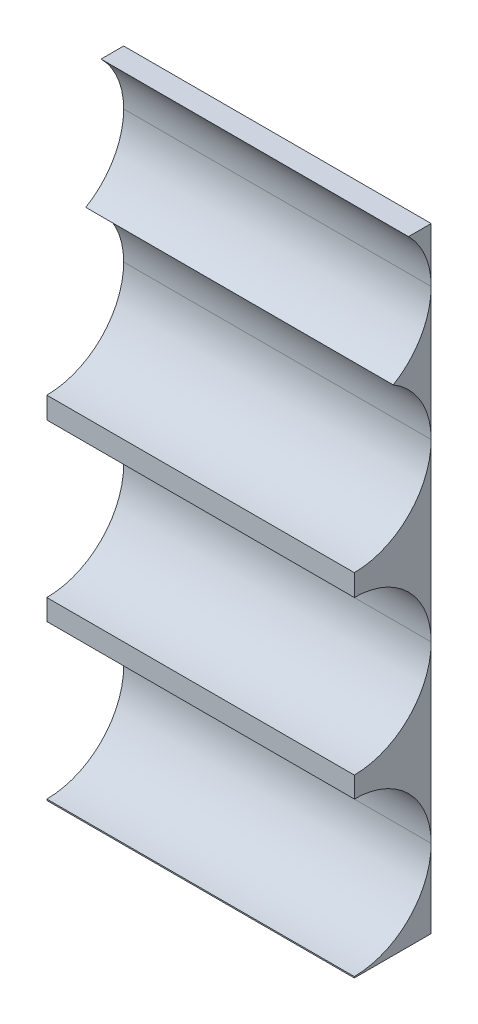
ISO-10303-21;
HEADER;
FILE_DESCRIPTION(('STEP AP214'),'2;1');
FILE_NAME('part.step','',(''),(''),'','','');
FILE_SCHEMA(('AUTOMOTIVE_DESIGN { 1 0 10303 214 1 1 1 1 }'));
ENDSEC;
DATA;
#1=APPLICATION_CONTEXT('core data for automotive mechanical design processes');
#2=APPLICATION_PROTOCOL_DEFINITION('international standard','automotive_design',2000,#1);
#3=PRODUCT_CONTEXT('',#1,'mechanical');
#4=PRODUCT('Part','Part','',(#3));
#5=PRODUCT_RELATED_PRODUCT_CATEGORY('part','',(#4));
#6=PRODUCT_DEFINITION_FORMATION('','',#4);
#7=PRODUCT_DEFINITION_CONTEXT('part definition',#1,'design');
#8=PRODUCT_DEFINITION('design','',#6,#7);
#9=PRODUCT_DEFINITION_SHAPE('','',#8);
#10=(LENGTH_UNIT() NAMED_UNIT(*) SI_UNIT(.MILLI.,.METRE.));
#11=(NAMED_UNIT(*) PLANE_ANGLE_UNIT() SI_UNIT($,.RADIAN.));
#12=(NAMED_UNIT(*) SI_UNIT($,.STERADIAN.) SOLID_ANGLE_UNIT());
#13=UNCERTAINTY_MEASURE_WITH_UNIT(LENGTH_MEASURE(1.E-05),#10,'distance_accuracy_value','');
#14=(GEOMETRIC_REPRESENTATION_CONTEXT(3) GLOBAL_UNCERTAINTY_ASSIGNED_CONTEXT((#13)) GLOBAL_UNIT_ASSIGNED_CONTEXT((#10,
#11,#12)) REPRESENTATION_CONTEXT('',''));
#15=CARTESIAN_POINT('',(0.,0.,0.));
#16=DIRECTION('',(0.,0.,1.));
#17=DIRECTION('',(1.,0.,0.));
#18=AXIS2_PLACEMENT_3D('',#15,#16,#17);
#19=CARTESIAN_POINT('',(0.,0.,2.));
#20=DIRECTION('',(0.,0.,-1.));
#21=DIRECTION('',(-1.,0.,0.));
#22=AXIS2_PLACEMENT_3D('',#19,#20,#21);
#23=PLANE('',#22);
#24=DIRECTION('',(0.,1.,0.));
#25=VECTOR('',#24,1.);
#26=CARTESIAN_POINT('',(8.,0.,2.));
#27=LINE('',#26,#25);
#28=CARTESIAN_POINT('',(8.,0.,2.));
#29=VERTEX_POINT('',#28);
#30=CARTESIAN_POINT('',(8.,0.0325402189467203,2.));
#31=VERTEX_POINT('',#30);
#32=EDGE_CURVE('E54',#29,#31,#27,.T.);
#33=ORIENTED_EDGE('',*,*,#32,.T.);
#34=DIRECTION('',(-1.,0.,0.));
#35=VECTOR('',#34,1.);
#36=CARTESIAN_POINT('',(15.1521826124603,0.0325402189467207,2.));
#37=LINE('',#36,#35);
#38=CARTESIAN_POINT('',(0.,0.0325402189467207,2.));
#39=VERTEX_POINT('',#38);
#40=EDGE_CURVE('E91',#31,#39,#37,.T.);
#41=ORIENTED_EDGE('',*,*,#40,.T.);
#42=DIRECTION('',(0.,-1.,0.));
#43=VECTOR('',#42,1.);
#44=CARTESIAN_POINT('',(0.,0.,2.));
#45=LINE('',#44,#43);
#46=CARTESIAN_POINT('',(0.,0.,2.));
#47=VERTEX_POINT('',#46);
#48=EDGE_CURVE('E86',#39,#47,#45,.T.);
#49=ORIENTED_EDGE('',*,*,#48,.T.);
#50=DIRECTION('',(1.,0.,0.));
#51=VECTOR('',#50,1.);
#52=CARTESIAN_POINT('',(0.,0.,2.));
#53=LINE('',#52,#51);
#54=EDGE_CURVE('E89',#47,#29,#53,.T.);
#55=ORIENTED_EDGE('',*,*,#54,.T.);
#56=EDGE_LOOP('',(#33,#41,#49,#55));
#57=FACE_BOUND('',#56,.T.);
#58=ADVANCED_FACE('F50',(#57),#23,.F.);
#59=CARTESIAN_POINT('',(0.,0.,2.));
#60=DIRECTION('',(1.,0.,0.));
#61=DIRECTION('',(0.,0.,-1.));
#62=AXIS2_PLACEMENT_3D('',#59,#60,#61);
#63=PLANE('',#62);
#64=ORIENTED_EDGE('',*,*,#48,.F.);
#65=CARTESIAN_POINT('',(0.,2.03254021894672,2.));
#66=DIRECTION('',(-1.,0.,0.));
#67=DIRECTION('',(0.,0.,1.));
#68=AXIS2_PLACEMENT_3D('',#65,#66,#67);
#69=CIRCLE('',#68,2.);
#70=CARTESIAN_POINT('',(0.,2.03254021894672,0.));
#71=VERTEX_POINT('',#70);
#72=EDGE_CURVE('E60',#71,#39,#69,.T.);
#73=ORIENTED_EDGE('',*,*,#72,.F.);
#74=DIRECTION('',(0.,-1.,0.));
#75=VECTOR('',#74,1.);
#76=CARTESIAN_POINT('',(0.,0.,0.));
#77=LINE('',#76,#75);
#78=CARTESIAN_POINT('',(0.,0.,0.));
#79=VERTEX_POINT('',#78);
#80=EDGE_CURVE('E102',#71,#79,#77,.T.);
#81=ORIENTED_EDGE('',*,*,#80,.T.);
#82=DIRECTION('',(0.,0.,-1.));
#83=VECTOR('',#82,1.);
#84=CARTESIAN_POINT('',(0.,0.,2.));
#85=LINE('',#84,#83);
#86=EDGE_CURVE('E98',#47,#79,#85,.T.);
#87=ORIENTED_EDGE('',*,*,#86,.F.);
#88=EDGE_LOOP('',(#64,#73,#81,#87));
#89=FACE_BOUND('',#88,.T.);
#90=ADVANCED_FACE('F52',(#89),#63,.F.);
#91=CARTESIAN_POINT('',(0.,0.,2.));
#92=DIRECTION('',(0.,1.,0.));
#93=DIRECTION('',(0.,0.,1.));
#94=AXIS2_PLACEMENT_3D('',#91,#92,#93);
#95=PLANE('',#94);
#96=DIRECTION('',(1.,0.,0.));
#97=VECTOR('',#96,1.);
#98=CARTESIAN_POINT('',(0.,0.,0.));
#99=LINE('',#98,#97);
#100=CARTESIAN_POINT('',(8.,0.,0.));
#101=VERTEX_POINT('',#100);
#102=EDGE_CURVE('E107',#79,#101,#99,.T.);
#103=ORIENTED_EDGE('',*,*,#102,.T.);
#104=DIRECTION('',(0.,0.,-1.));
#105=VECTOR('',#104,1.);
#106=CARTESIAN_POINT('',(8.,0.,2.));
#107=LINE('',#106,#105);
#108=EDGE_CURVE('E100',#29,#101,#107,.T.);
#109=ORIENTED_EDGE('',*,*,#108,.F.);
#110=ORIENTED_EDGE('',*,*,#54,.F.);
#111=ORIENTED_EDGE('',*,*,#86,.T.);
#112=EDGE_LOOP('',(#103,#109,#110,#111));
#113=FACE_BOUND('',#112,.T.);
#114=ADVANCED_FACE('F97',(#113),#95,.F.);
#115=CARTESIAN_POINT('',(8.,0.,2.));
#116=DIRECTION('',(-1.,0.,0.));
#117=DIRECTION('',(0.,0.,1.));
#118=AXIS2_PLACEMENT_3D('',#115,#116,#117);
#119=PLANE('',#118);
#120=DIRECTION('',(0.,1.,0.));
#121=VECTOR('',#120,1.);
#122=CARTESIAN_POINT('',(8.,0.,0.));
#123=LINE('',#122,#121);
#124=CARTESIAN_POINT('',(8.,2.03254021894672,0.));
#125=VERTEX_POINT('',#124);
#126=EDGE_CURVE('E106',#101,#125,#123,.T.);
#127=ORIENTED_EDGE('',*,*,#126,.T.);
#128=CARTESIAN_POINT('',(8.,2.03254021894672,2.));
#129=DIRECTION('',(-1.,0.,0.));
#130=DIRECTION('',(0.,0.,1.));
#131=AXIS2_PLACEMENT_3D('',#128,#129,#130);
#132=CIRCLE('',#131,2.);
#133=EDGE_CURVE('E12',#31,#125,#132,.F.);
#134=ORIENTED_EDGE('',*,*,#133,.F.);
#135=ORIENTED_EDGE('',*,*,#32,.F.);
#136=ORIENTED_EDGE('',*,*,#108,.T.);
#137=EDGE_LOOP('',(#127,#134,#135,#136));
#138=FACE_BOUND('',#137,.T.);
#139=ADVANCED_FACE('F124',(#138),#119,.F.);
#140=CARTESIAN_POINT('',(0.,0.,0.));
#141=DIRECTION('',(0.,0.,-1.));
#142=DIRECTION('',(-1.,0.,0.));
#143=AXIS2_PLACEMENT_3D('',#140,#141,#142);
#144=PLANE('',#143);
#145=DIRECTION('',(-1.,0.,0.));
#146=VECTOR('',#145,1.);
#147=CARTESIAN_POINT('',(15.1521826124603,2.03254021894672,0.));
#148=LINE('',#147,#146);
#149=EDGE_CURVE('E113',#125,#71,#148,.T.);
#150=ORIENTED_EDGE('',*,*,#149,.F.);
#151=ORIENTED_EDGE('',*,*,#126,.F.);
#152=ORIENTED_EDGE('',*,*,#102,.F.);
#153=ORIENTED_EDGE('',*,*,#80,.F.);
#154=EDGE_LOOP('',(#150,#151,#152,#153));
#155=FACE_BOUND('',#154,.T.);
#156=ADVANCED_FACE('F122',(#155),#144,.T.);
#157=CARTESIAN_POINT('',(15.1521826124603,2.03254021894672,2.));
#158=DIRECTION('',(-1.,0.,0.));
#159=DIRECTION('',(0.,0.,1.));
#160=AXIS2_PLACEMENT_3D('',#157,#158,#159);
#161=CYLINDRICAL_SURFACE('',#160,2.);
#162=ORIENTED_EDGE('',*,*,#149,.T.);
#163=ORIENTED_EDGE('',*,*,#72,.T.);
#164=ORIENTED_EDGE('',*,*,#40,.F.);
#165=ORIENTED_EDGE('',*,*,#133,.T.);
#166=EDGE_LOOP('',(#162,#163,#164,#165));
#167=FACE_BOUND('',#166,.T.);
#168=ADVANCED_FACE('F119',(#167),#161,.F.);
#169=CLOSED_SHELL('',(#58,#90,#114,#139,#156,#168));
#170=MANIFOLD_SOLID_BREP('B2',#169);
#171=CARTESIAN_POINT('',(0.,0.,2.));
#172=DIRECTION('',(0.,0.,-1.));
#173=DIRECTION('',(-1.,0.,0.));
#174=AXIS2_PLACEMENT_3D('',#171,#172,#173);
#175=PLANE('',#174);
#176=DIRECTION('',(0.,1.,0.));
#177=VECTOR('',#176,1.);
#178=CARTESIAN_POINT('',(8.,0.,2.));
#179=LINE('',#178,#177);
#180=CARTESIAN_POINT('',(8.,8.57299340167583,2.));
#181=VERTEX_POINT('',#180);
#182=CARTESIAN_POINT('',(8.,9.13314365069584,2.));
#183=VERTEX_POINT('',#182);
#184=EDGE_CURVE('E188',#181,#183,#179,.T.);
#185=ORIENTED_EDGE('',*,*,#184,.T.);
#186=DIRECTION('',(-1.,0.,0.));
#187=VECTOR('',#186,1.);
#188=CARTESIAN_POINT('',(15.1521826124603,9.13314365069584,2.));
#189=LINE('',#188,#187);
#190=CARTESIAN_POINT('',(0.,9.13314365069584,2.));
#191=VERTEX_POINT('',#190);
#192=EDGE_CURVE('E243',#183,#191,#189,.T.);
#193=ORIENTED_EDGE('',*,*,#192,.T.);
#194=DIRECTION('',(0.,-1.,0.));
#195=VECTOR('',#194,1.);
#196=CARTESIAN_POINT('',(0.,0.,2.));
#197=LINE('',#196,#195);
#198=CARTESIAN_POINT('',(0.,8.57299340167583,2.));
#199=VERTEX_POINT('',#198);
#200=EDGE_CURVE('E236',#191,#199,#197,.T.);
#201=ORIENTED_EDGE('',*,*,#200,.T.);
#202=DIRECTION('',(-1.,0.,0.));
#203=VECTOR('',#202,1.);
#204=CARTESIAN_POINT('',(15.1521826124603,8.57299340167583,2.));
#205=LINE('',#204,#203);
#206=EDGE_CURVE('E218',#181,#199,#205,.T.);
#207=ORIENTED_EDGE('',*,*,#206,.F.);
#208=EDGE_LOOP('',(#185,#193,#201,#207));
#209=FACE_BOUND('',#208,.T.);
#210=ADVANCED_FACE('F184',(#209),#175,.F.);
#211=CARTESIAN_POINT('',(0.,0.,0.));
#212=DIRECTION('',(0.,0.,-1.));
#213=DIRECTION('',(-1.,0.,0.));
#214=AXIS2_PLACEMENT_3D('',#211,#212,#213);
#215=PLANE('',#214);
#216=DIRECTION('',(-1.,0.,0.));
#217=VECTOR('',#216,1.);
#218=CARTESIAN_POINT('',(15.1521826124603,11.1331436506958,0.));
#219=LINE('',#218,#217);
#220=CARTESIAN_POINT('',(8.,11.1331436506958,0.));
#221=VERTEX_POINT('',#220);
#222=CARTESIAN_POINT('',(0.,11.1331436506958,0.));
#223=VERTEX_POINT('',#222);
#224=EDGE_CURVE('E240',#221,#223,#219,.T.);
#225=ORIENTED_EDGE('',*,*,#224,.F.);
#226=DIRECTION('',(0.,1.,0.));
#227=VECTOR('',#226,1.);
#228=CARTESIAN_POINT('',(8.,0.,0.));
#229=LINE('',#228,#227);
#230=CARTESIAN_POINT('',(8.,6.57299340167583,0.));
#231=VERTEX_POINT('',#230);
#232=EDGE_CURVE('E248',#231,#221,#229,.T.);
#233=ORIENTED_EDGE('',*,*,#232,.F.);
#234=DIRECTION('',(-1.,0.,0.));
#235=VECTOR('',#234,1.);
#236=CARTESIAN_POINT('',(15.1521826124603,6.57299340167583,0.));
#237=LINE('',#236,#235);
#238=CARTESIAN_POINT('',(0.,6.57299340167583,0.));
#239=VERTEX_POINT('',#238);
#240=EDGE_CURVE('E245',#231,#239,#237,.T.);
#241=ORIENTED_EDGE('',*,*,#240,.T.);
#242=DIRECTION('',(0.,-1.,0.));
#243=VECTOR('',#242,1.);
#244=CARTESIAN_POINT('',(0.,0.,0.));
#245=LINE('',#244,#243);
#246=EDGE_CURVE('E238',#223,#239,#245,.T.);
#247=ORIENTED_EDGE('',*,*,#246,.F.);
#248=EDGE_LOOP('',(#225,#233,#241,#247));
#249=FACE_BOUND('',#248,.T.);
#250=ADVANCED_FACE('F267',(#249),#215,.T.);
#251=CARTESIAN_POINT('',(8.,0.,2.));
#252=DIRECTION('',(-1.,0.,0.));
#253=DIRECTION('',(0.,0.,1.));
#254=AXIS2_PLACEMENT_3D('',#251,#252,#253);
#255=PLANE('',#254);
#256=ORIENTED_EDGE('',*,*,#232,.T.);
#257=CARTESIAN_POINT('',(8.,11.1331436506958,2.));
#258=DIRECTION('',(-1.,0.,0.));
#259=DIRECTION('',(0.,0.,1.));
#260=AXIS2_PLACEMENT_3D('',#257,#258,#259);
#261=CIRCLE('',#260,2.);
#262=EDGE_CURVE('E48',#183,#221,#261,.F.);
#263=ORIENTED_EDGE('',*,*,#262,.F.);
#264=ORIENTED_EDGE('',*,*,#184,.F.);
#265=CARTESIAN_POINT('',(8.,6.57299340167583,2.));
#266=DIRECTION('',(-1.,0.,0.));
#267=DIRECTION('',(0.,0.,1.));
#268=AXIS2_PLACEMENT_3D('',#265,#266,#267);
#269=CIRCLE('',#268,2.);
#270=EDGE_CURVE('E225',#231,#181,#269,.F.);
#271=ORIENTED_EDGE('',*,*,#270,.F.);
#272=EDGE_LOOP('',(#256,#263,#264,#271));
#273=FACE_BOUND('',#272,.T.);
#274=ADVANCED_FACE('F269',(#273),#255,.F.);
#275=CARTESIAN_POINT('',(0.,0.,2.));
#276=DIRECTION('',(1.,0.,0.));
#277=DIRECTION('',(0.,0.,-1.));
#278=AXIS2_PLACEMENT_3D('',#275,#276,#277);
#279=PLANE('',#278);
#280=ORIENTED_EDGE('',*,*,#200,.F.);
#281=CARTESIAN_POINT('',(0.,11.1331436506958,2.));
#282=DIRECTION('',(-1.,0.,0.));
#283=DIRECTION('',(0.,0.,1.));
#284=AXIS2_PLACEMENT_3D('',#281,#282,#283);
#285=CIRCLE('',#284,2.);
#286=EDGE_CURVE('E195',#223,#191,#285,.T.);
#287=ORIENTED_EDGE('',*,*,#286,.F.);
#288=ORIENTED_EDGE('',*,*,#246,.T.);
#289=CARTESIAN_POINT('',(0.,6.57299340167583,2.));
#290=DIRECTION('',(-1.,0.,0.));
#291=DIRECTION('',(0.,0.,1.));
#292=AXIS2_PLACEMENT_3D('',#289,#290,#291);
#293=CIRCLE('',#292,2.);
#294=EDGE_CURVE('E222',#199,#239,#293,.T.);
#295=ORIENTED_EDGE('',*,*,#294,.F.);
#296=EDGE_LOOP('',(#280,#287,#288,#295));
#297=FACE_BOUND('',#296,.T.);
#298=ADVANCED_FACE('F186',(#297),#279,.F.);
#299=CARTESIAN_POINT('',(15.1521826124603,6.57299340167583,2.));
#300=DIRECTION('',(-1.,0.,0.));
#301=DIRECTION('',(0.,0.,1.));
#302=AXIS2_PLACEMENT_3D('',#299,#300,#301);
#303=CYLINDRICAL_SURFACE('',#302,2.);
#304=ORIENTED_EDGE('',*,*,#270,.T.);
#305=ORIENTED_EDGE('',*,*,#206,.T.);
#306=ORIENTED_EDGE('',*,*,#294,.T.);
#307=ORIENTED_EDGE('',*,*,#240,.F.);
#308=EDGE_LOOP('',(#304,#305,#306,#307));
#309=FACE_BOUND('',#308,.T.);
#310=ADVANCED_FACE('F220',(#309),#303,.F.);
#311=CARTESIAN_POINT('',(15.1521826124603,11.1331436506958,2.));
#312=DIRECTION('',(-1.,0.,0.));
#313=DIRECTION('',(0.,0.,1.));
#314=AXIS2_PLACEMENT_3D('',#311,#312,#313);
#315=CYLINDRICAL_SURFACE('',#314,2.);
#316=ORIENTED_EDGE('',*,*,#224,.T.);
#317=ORIENTED_EDGE('',*,*,#286,.T.);
#318=ORIENTED_EDGE('',*,*,#192,.F.);
#319=ORIENTED_EDGE('',*,*,#262,.T.);
#320=EDGE_LOOP('',(#316,#317,#318,#319));
#321=FACE_BOUND('',#320,.T.);
#322=ADVANCED_FACE('F263',(#321),#315,.F.);
#323=CLOSED_SHELL('',(#210,#250,#274,#298,#310,#322));
#324=MANIFOLD_SOLID_BREP('B6',#323);
#325=CARTESIAN_POINT('',(0.,0.,0.));
#326=DIRECTION('',(0.,0.,-1.));
#327=DIRECTION('',(-1.,0.,0.));
#328=AXIS2_PLACEMENT_3D('',#325,#326,#327);
#329=PLANE('',#328);
#330=DIRECTION('',(0.,1.,0.));
#331=VECTOR('',#330,1.);
#332=CARTESIAN_POINT('',(8.,0.,0.));
#333=LINE('',#332,#331);
#334=CARTESIAN_POINT('',(8.,2.03254021894672,0.));
#335=VERTEX_POINT('',#334);
#336=CARTESIAN_POINT('',(8.,6.57299340167583,0.));
#337=VERTEX_POINT('',#336);
#338=EDGE_CURVE('E387',#335,#337,#333,.T.);
#339=ORIENTED_EDGE('',*,*,#338,.F.);
#340=DIRECTION('',(-1.,0.,0.));
#341=VECTOR('',#340,1.);
#342=CARTESIAN_POINT('',(15.1521826124603,2.03254021894672,0.));
#343=LINE('',#342,#341);
#344=CARTESIAN_POINT('',(0.,2.03254021894672,0.));
#345=VERTEX_POINT('',#344);
#346=EDGE_CURVE('E334',#335,#345,#343,.T.);
#347=ORIENTED_EDGE('',*,*,#346,.T.);
#348=DIRECTION('',(0.,-1.,0.));
#349=VECTOR('',#348,1.);
#350=CARTESIAN_POINT('',(0.,0.,0.));
#351=LINE('',#350,#349);
#352=CARTESIAN_POINT('',(0.,6.57299340167583,0.));
#353=VERTEX_POINT('',#352);
#354=EDGE_CURVE('E380',#353,#345,#351,.T.);
#355=ORIENTED_EDGE('',*,*,#354,.F.);
#356=DIRECTION('',(-1.,0.,0.));
#357=VECTOR('',#356,1.);
#358=CARTESIAN_POINT('',(15.1521826124603,6.57299340167583,0.));
#359=LINE('',#358,#357);
#360=EDGE_CURVE('E391',#337,#353,#359,.T.);
#361=ORIENTED_EDGE('',*,*,#360,.F.);
#362=EDGE_LOOP('',(#339,#347,#355,#361));
#363=FACE_BOUND('',#362,.T.);
#364=ADVANCED_FACE('F330',(#363),#329,.T.);
#365=CARTESIAN_POINT('',(0.,0.,2.));
#366=DIRECTION('',(0.,0.,-1.));
#367=DIRECTION('',(-1.,0.,0.));
#368=AXIS2_PLACEMENT_3D('',#365,#366,#367);
#369=PLANE('',#368);
#370=DIRECTION('',(0.,-1.,0.));
#371=VECTOR('',#370,1.);
#372=CARTESIAN_POINT('',(0.,0.,2.));
#373=LINE('',#372,#371);
#374=CARTESIAN_POINT('',(0.,4.57299340167583,2.));
#375=VERTEX_POINT('',#374);
#376=CARTESIAN_POINT('',(0.,4.03254021894672,2.));
#377=VERTEX_POINT('',#376);
#378=EDGE_CURVE('E378',#375,#377,#373,.T.);
#379=ORIENTED_EDGE('',*,*,#378,.T.);
#380=DIRECTION('',(-1.,0.,0.));
#381=VECTOR('',#380,1.);
#382=CARTESIAN_POINT('',(15.1521826124603,4.03254021894672,2.));
#383=LINE('',#382,#381);
#384=CARTESIAN_POINT('',(8.,4.03254021894672,2.));
#385=VERTEX_POINT('',#384);
#386=EDGE_CURVE('E340',#385,#377,#383,.T.);
#387=ORIENTED_EDGE('',*,*,#386,.F.);
#388=DIRECTION('',(0.,1.,0.));
#389=VECTOR('',#388,1.);
#390=CARTESIAN_POINT('',(8.,0.,2.));
#391=LINE('',#390,#389);
#392=CARTESIAN_POINT('',(8.,4.57299340167583,2.));
#393=VERTEX_POINT('',#392);
#394=EDGE_CURVE('E384',#385,#393,#391,.T.);
#395=ORIENTED_EDGE('',*,*,#394,.T.);
#396=DIRECTION('',(-1.,0.,0.));
#397=VECTOR('',#396,1.);
#398=CARTESIAN_POINT('',(15.1521826124603,4.57299340167583,2.));
#399=LINE('',#398,#397);
#400=EDGE_CURVE('E383',#393,#375,#399,.T.);
#401=ORIENTED_EDGE('',*,*,#400,.T.);
#402=EDGE_LOOP('',(#379,#387,#395,#401));
#403=FACE_BOUND('',#402,.T.);
#404=ADVANCED_FACE('F382',(#403),#369,.F.);
#405=CARTESIAN_POINT('',(8.,0.,2.));
#406=DIRECTION('',(-1.,0.,0.));
#407=DIRECTION('',(0.,0.,1.));
#408=AXIS2_PLACEMENT_3D('',#405,#406,#407);
#409=PLANE('',#408);
#410=ORIENTED_EDGE('',*,*,#394,.F.);
#411=CARTESIAN_POINT('',(8.,2.03254021894672,2.));
#412=DIRECTION('',(-1.,0.,0.));
#413=DIRECTION('',(0.,0.,1.));
#414=AXIS2_PLACEMENT_3D('',#411,#412,#413);
#415=CIRCLE('',#414,2.);
#416=EDGE_CURVE('E365',#335,#385,#415,.F.);
#417=ORIENTED_EDGE('',*,*,#416,.F.);
#418=ORIENTED_EDGE('',*,*,#338,.T.);
#419=CARTESIAN_POINT('',(8.,6.57299340167583,2.));
#420=DIRECTION('',(-1.,0.,0.));
#421=DIRECTION('',(0.,0.,1.));
#422=AXIS2_PLACEMENT_3D('',#419,#420,#421);
#423=CIRCLE('',#422,2.);
#424=EDGE_CURVE('E394',#393,#337,#423,.F.);
#425=ORIENTED_EDGE('',*,*,#424,.F.);
#426=EDGE_LOOP('',(#410,#417,#418,#425));
#427=FACE_BOUND('',#426,.T.);
#428=ADVANCED_FACE('F404',(#427),#409,.F.);
#429=CARTESIAN_POINT('',(0.,0.,2.));
#430=DIRECTION('',(1.,0.,0.));
#431=DIRECTION('',(0.,0.,-1.));
#432=AXIS2_PLACEMENT_3D('',#429,#430,#431);
#433=PLANE('',#432);
#434=ORIENTED_EDGE('',*,*,#354,.T.);
#435=CARTESIAN_POINT('',(0.,2.03254021894672,2.));
#436=DIRECTION('',(-1.,0.,0.));
#437=DIRECTION('',(0.,0.,1.));
#438=AXIS2_PLACEMENT_3D('',#435,#436,#437);
#439=CIRCLE('',#438,2.);
#440=EDGE_CURVE('E182',#377,#345,#439,.T.);
#441=ORIENTED_EDGE('',*,*,#440,.F.);
#442=ORIENTED_EDGE('',*,*,#378,.F.);
#443=CARTESIAN_POINT('',(0.,6.57299340167583,2.));
#444=DIRECTION('',(-1.,0.,0.));
#445=DIRECTION('',(0.,0.,1.));
#446=AXIS2_PLACEMENT_3D('',#443,#444,#445);
#447=CIRCLE('',#446,2.);
#448=EDGE_CURVE('E392',#353,#375,#447,.T.);
#449=ORIENTED_EDGE('',*,*,#448,.F.);
#450=EDGE_LOOP('',(#434,#441,#442,#449));
#451=FACE_BOUND('',#450,.T.);
#452=ADVANCED_FACE('F376',(#451),#433,.F.);
#453=CARTESIAN_POINT('',(15.1521826124603,6.57299340167583,2.));
#454=DIRECTION('',(-1.,0.,0.));
#455=DIRECTION('',(0.,0.,1.));
#456=AXIS2_PLACEMENT_3D('',#453,#454,#455);
#457=CYLINDRICAL_SURFACE('',#456,2.);
#458=ORIENTED_EDGE('',*,*,#360,.T.);
#459=ORIENTED_EDGE('',*,*,#448,.T.);
#460=ORIENTED_EDGE('',*,*,#400,.F.);
#461=ORIENTED_EDGE('',*,*,#424,.T.);
#462=EDGE_LOOP('',(#458,#459,#460,#461));
#463=FACE_BOUND('',#462,.T.);
#464=ADVANCED_FACE('F400',(#463),#457,.F.);
#465=CARTESIAN_POINT('',(15.1521826124603,2.03254021894672,2.));
#466=DIRECTION('',(-1.,0.,0.));
#467=DIRECTION('',(0.,0.,1.));
#468=AXIS2_PLACEMENT_3D('',#465,#466,#467);
#469=CYLINDRICAL_SURFACE('',#468,2.);
#470=ORIENTED_EDGE('',*,*,#416,.T.);
#471=ORIENTED_EDGE('',*,*,#386,.T.);
#472=ORIENTED_EDGE('',*,*,#440,.T.);
#473=ORIENTED_EDGE('',*,*,#346,.F.);
#474=EDGE_LOOP('',(#470,#471,#472,#473));
#475=FACE_BOUND('',#474,.T.);
#476=ADVANCED_FACE('F332',(#475),#469,.F.);
#477=CLOSED_SHELL('',(#364,#404,#428,#452,#464,#476));
#478=MANIFOLD_SOLID_BREP('B42',#477);
#479=CARTESIAN_POINT('',(0.,0.,0.));
#480=DIRECTION('',(0.,0.,-1.));
#481=DIRECTION('',(-1.,0.,0.));
#482=AXIS2_PLACEMENT_3D('',#479,#480,#481);
#483=PLANE('',#482);
#484=DIRECTION('',(-1.,0.,0.));
#485=VECTOR('',#484,1.);
#486=CARTESIAN_POINT('',(15.1521826124603,14.5822970258749,0.));
#487=LINE('',#486,#485);
#488=CARTESIAN_POINT('',(8.,14.5822970258749,0.));
#489=VERTEX_POINT('',#488);
#490=CARTESIAN_POINT('',(0.,14.5822970258749,0.));
#491=VERTEX_POINT('',#490);
#492=EDGE_CURVE('E500',#489,#491,#487,.T.);
#493=ORIENTED_EDGE('',*,*,#492,.F.);
#494=DIRECTION('',(0.,1.,0.));
#495=VECTOR('',#494,1.);
#496=CARTESIAN_POINT('',(8.,0.,0.));
#497=LINE('',#496,#495);
#498=CARTESIAN_POINT('',(8.,11.1331436506958,0.));
#499=VERTEX_POINT('',#498);
#500=EDGE_CURVE('E510',#499,#489,#497,.T.);
#501=ORIENTED_EDGE('',*,*,#500,.F.);
#502=DIRECTION('',(-1.,0.,0.));
#503=VECTOR('',#502,1.);
#504=CARTESIAN_POINT('',(15.1521826124603,11.1331436506958,0.));
#505=LINE('',#504,#503);
#506=CARTESIAN_POINT('',(0.,11.1331436506958,0.));
#507=VERTEX_POINT('',#506);
#508=EDGE_CURVE('E467',#499,#507,#505,.T.);
#509=ORIENTED_EDGE('',*,*,#508,.T.);
#510=DIRECTION('',(0.,-1.,0.));
#511=VECTOR('',#510,1.);
#512=CARTESIAN_POINT('',(0.,0.,0.));
#513=LINE('',#512,#511);
#514=EDGE_CURVE('E508',#491,#507,#513,.T.);
#515=ORIENTED_EDGE('',*,*,#514,.F.);
#516=EDGE_LOOP('',(#493,#501,#509,#515));
#517=FACE_BOUND('',#516,.T.);
#518=ADVANCED_FACE('F463',(#517),#483,.T.);
#519=CARTESIAN_POINT('',(8.,0.,2.));
#520=DIRECTION('',(-1.,0.,0.));
#521=DIRECTION('',(0.,0.,1.));
#522=AXIS2_PLACEMENT_3D('',#519,#520,#521);
#523=PLANE('',#522);
#524=ORIENTED_EDGE('',*,*,#500,.T.);
#525=CARTESIAN_POINT('',(8.,14.5822970258749,2.));
#526=DIRECTION('',(-1.,0.,0.));
#527=DIRECTION('',(0.,0.,1.));
#528=AXIS2_PLACEMENT_3D('',#525,#526,#527);
#529=CIRCLE('',#528,2.);
#530=CARTESIAN_POINT('',(8.,12.8577203382854,0.987164747541455));
#531=VERTEX_POINT('',#530);
#532=EDGE_CURVE('E328',#531,#489,#529,.F.);
#533=ORIENTED_EDGE('',*,*,#532,.F.);
#534=CARTESIAN_POINT('',(8.,11.1331436506958,2.));
#535=DIRECTION('',(-1.,0.,0.));
#536=DIRECTION('',(0.,0.,1.));
#537=AXIS2_PLACEMENT_3D('',#534,#535,#536);
#538=CIRCLE('',#537,2.);
#539=EDGE_CURVE('E492',#499,#531,#538,.F.);
#540=ORIENTED_EDGE('',*,*,#539,.F.);
#541=EDGE_LOOP('',(#524,#533,#540));
#542=FACE_BOUND('',#541,.T.);
#543=ADVANCED_FACE('F517',(#542),#523,.F.);
#544=CARTESIAN_POINT('',(0.,0.,2.));
#545=DIRECTION('',(1.,0.,0.));
#546=DIRECTION('',(0.,0.,-1.));
#547=AXIS2_PLACEMENT_3D('',#544,#545,#546);
#548=PLANE('',#547);
#549=CARTESIAN_POINT('',(0.,11.1331436506958,2.));
#550=DIRECTION('',(-1.,0.,0.));
#551=DIRECTION('',(0.,0.,1.));
#552=AXIS2_PLACEMENT_3D('',#549,#550,#551);
#553=CIRCLE('',#552,2.);
#554=CARTESIAN_POINT('',(0.,12.8577203382854,0.987164747541455));
#555=VERTEX_POINT('',#554);
#556=EDGE_CURVE('E496',#555,#507,#553,.T.);
#557=ORIENTED_EDGE('',*,*,#556,.F.);
#558=CARTESIAN_POINT('',(0.,14.5822970258749,2.));
#559=DIRECTION('',(-1.,0.,0.));
#560=DIRECTION('',(0.,0.,1.));
#561=AXIS2_PLACEMENT_3D('',#558,#559,#560);
#562=CIRCLE('',#561,2.);
#563=EDGE_CURVE('E473',#491,#555,#562,.T.);
#564=ORIENTED_EDGE('',*,*,#563,.F.);
#565=ORIENTED_EDGE('',*,*,#514,.T.);
#566=EDGE_LOOP('',(#557,#564,#565));
#567=FACE_BOUND('',#566,.T.);
#568=ADVANCED_FACE('F512',(#567),#548,.F.);
#569=CARTESIAN_POINT('',(15.1521826124603,11.1331436506958,2.));
#570=DIRECTION('',(-1.,0.,0.));
#571=DIRECTION('',(0.,0.,1.));
#572=AXIS2_PLACEMENT_3D('',#569,#570,#571);
#573=CYLINDRICAL_SURFACE('',#572,2.);
#574=ORIENTED_EDGE('',*,*,#539,.T.);
#575=DIRECTION('',(-1.,0.,0.));
#576=VECTOR('',#575,1.);
#577=CARTESIAN_POINT('',(15.1521826124603,12.8577203382854,0.987164747541455));
#578=LINE('',#577,#576);
#579=EDGE_CURVE('E515',#531,#555,#578,.T.);
#580=ORIENTED_EDGE('',*,*,#579,.T.);
#581=ORIENTED_EDGE('',*,*,#556,.T.);
#582=ORIENTED_EDGE('',*,*,#508,.F.);
#583=EDGE_LOOP('',(#574,#580,#581,#582));
#584=FACE_BOUND('',#583,.T.);
#585=ADVANCED_FACE('F465',(#584),#573,.F.);
#586=CARTESIAN_POINT('',(15.1521826124603,14.5822970258749,2.));
#587=DIRECTION('',(-1.,0.,0.));
#588=DIRECTION('',(0.,0.,1.));
#589=AXIS2_PLACEMENT_3D('',#586,#587,#588);
#590=CYLINDRICAL_SURFACE('',#589,2.);
#591=ORIENTED_EDGE('',*,*,#492,.T.);
#592=ORIENTED_EDGE('',*,*,#563,.T.);
#593=ORIENTED_EDGE('',*,*,#579,.F.);
#594=ORIENTED_EDGE('',*,*,#532,.T.);
#595=EDGE_LOOP('',(#591,#592,#593,#594));
#596=FACE_BOUND('',#595,.T.);
#597=ADVANCED_FACE('F502',(#596),#590,.F.);
#598=CLOSED_SHELL('',(#518,#543,#568,#585,#597));
#599=MANIFOLD_SOLID_BREP('B176',#598);
#600=CARTESIAN_POINT('',(0.,0.,0.));
#601=DIRECTION('',(0.,0.,-1.));
#602=DIRECTION('',(-1.,0.,0.));
#603=AXIS2_PLACEMENT_3D('',#600,#601,#602);
#604=PLANE('',#603);
#605=DIRECTION('',(0.,1.,0.));
#606=VECTOR('',#605,1.);
#607=CARTESIAN_POINT('',(8.,0.,0.));
#608=LINE('',#607,#606);
#609=CARTESIAN_POINT('',(8.,14.5822970258749,0.));
#610=VERTEX_POINT('',#609);
#611=CARTESIAN_POINT('',(8.,16.,0.));
#612=VERTEX_POINT('',#611);
#613=EDGE_CURVE('E609',#610,#612,#608,.T.);
#614=ORIENTED_EDGE('',*,*,#613,.F.);
#615=DIRECTION('',(-1.,0.,0.));
#616=VECTOR('',#615,1.);
#617=CARTESIAN_POINT('',(15.1521826124603,14.5822970258749,0.));
#618=LINE('',#617,#616);
#619=CARTESIAN_POINT('',(0.,14.5822970258749,0.));
#620=VERTEX_POINT('',#619);
#621=EDGE_CURVE('E461',#610,#620,#618,.T.);
#622=ORIENTED_EDGE('',*,*,#621,.T.);
#623=DIRECTION('',(0.,-1.,0.));
#624=VECTOR('',#623,1.);
#625=CARTESIAN_POINT('',(0.,0.,0.));
#626=LINE('',#625,#624);
#627=CARTESIAN_POINT('',(0.,16.,0.));
#628=VERTEX_POINT('',#627);
#629=EDGE_CURVE('E603',#628,#620,#626,.T.);
#630=ORIENTED_EDGE('',*,*,#629,.F.);
#631=DIRECTION('',(-1.,0.,0.));
#632=VECTOR('',#631,1.);
#633=CARTESIAN_POINT('',(0.,16.,0.));
#634=LINE('',#633,#632);
#635=EDGE_CURVE('E607',#612,#628,#634,.T.);
#636=ORIENTED_EDGE('',*,*,#635,.F.);
#637=EDGE_LOOP('',(#614,#622,#630,#636));
#638=FACE_BOUND('',#637,.T.);
#639=ADVANCED_FACE('F561',(#638),#604,.T.);
#640=CARTESIAN_POINT('',(0.,16.,2.));
#641=DIRECTION('',(0.,-1.,0.));
#642=DIRECTION('',(0.,0.,-1.));
#643=AXIS2_PLACEMENT_3D('',#640,#641,#642);
#644=PLANE('',#643);
#645=DIRECTION('',(0.,0.,-1.));
#646=VECTOR('',#645,1.);
#647=CARTESIAN_POINT('',(0.,16.,2.));
#648=LINE('',#647,#646);
#649=CARTESIAN_POINT('',(0.,16.,0.589284480429598));
#650=VERTEX_POINT('',#649);
#651=EDGE_CURVE('E600',#650,#628,#648,.T.);
#652=ORIENTED_EDGE('',*,*,#651,.F.);
#653=DIRECTION('',(-1.,0.,0.));
#654=VECTOR('',#653,1.);
#655=CARTESIAN_POINT('',(15.1521826124603,16.,0.589284480429598));
#656=LINE('',#655,#654);
#657=CARTESIAN_POINT('',(8.,16.,0.589284480429598));
#658=VERTEX_POINT('',#657);
#659=EDGE_CURVE('E590',#658,#650,#656,.T.);
#660=ORIENTED_EDGE('',*,*,#659,.F.);
#661=DIRECTION('',(0.,0.,-1.));
#662=VECTOR('',#661,1.);
#663=CARTESIAN_POINT('',(8.,16.,2.));
#664=LINE('',#663,#662);
#665=EDGE_CURVE('E569',#658,#612,#664,.T.);
#666=ORIENTED_EDGE('',*,*,#665,.T.);
#667=ORIENTED_EDGE('',*,*,#635,.T.);
#668=EDGE_LOOP('',(#652,#660,#666,#667));
#669=FACE_BOUND('',#668,.T.);
#670=ADVANCED_FACE('F605',(#669),#644,.F.);
#671=CARTESIAN_POINT('',(8.,0.,2.));
#672=DIRECTION('',(-1.,0.,0.));
#673=DIRECTION('',(0.,0.,1.));
#674=AXIS2_PLACEMENT_3D('',#671,#672,#673);
#675=PLANE('',#674);
#676=ORIENTED_EDGE('',*,*,#665,.F.);
#677=CARTESIAN_POINT('',(8.,14.5822970258749,2.));
#678=DIRECTION('',(-1.,0.,0.));
#679=DIRECTION('',(0.,0.,1.));
#680=AXIS2_PLACEMENT_3D('',#677,#678,#679);
#681=CIRCLE('',#680,2.);
#682=EDGE_CURVE('E593',#610,#658,#681,.F.);
#683=ORIENTED_EDGE('',*,*,#682,.F.);
#684=ORIENTED_EDGE('',*,*,#613,.T.);
#685=EDGE_LOOP('',(#676,#683,#684));
#686=FACE_BOUND('',#685,.T.);
#687=ADVANCED_FACE('F616',(#686),#675,.F.);
#688=CARTESIAN_POINT('',(0.,0.,2.));
#689=DIRECTION('',(1.,0.,0.));
#690=DIRECTION('',(0.,0.,-1.));
#691=AXIS2_PLACEMENT_3D('',#688,#689,#690);
#692=PLANE('',#691);
#693=ORIENTED_EDGE('',*,*,#629,.T.);
#694=CARTESIAN_POINT('',(0.,14.5822970258749,2.));
#695=DIRECTION('',(-1.,0.,0.));
#696=DIRECTION('',(0.,0.,1.));
#697=AXIS2_PLACEMENT_3D('',#694,#695,#696);
#698=CIRCLE('',#697,2.);
#699=EDGE_CURVE('E579',#650,#620,#698,.T.);
#700=ORIENTED_EDGE('',*,*,#699,.F.);
#701=ORIENTED_EDGE('',*,*,#651,.T.);
#702=EDGE_LOOP('',(#693,#700,#701));
#703=FACE_BOUND('',#702,.T.);
#704=ADVANCED_FACE('F563',(#703),#692,.F.);
#705=CARTESIAN_POINT('',(15.1521826124603,14.5822970258749,2.));
#706=DIRECTION('',(-1.,0.,0.));
#707=DIRECTION('',(0.,0.,1.));
#708=AXIS2_PLACEMENT_3D('',#705,#706,#707);
#709=CYLINDRICAL_SURFACE('',#708,2.);
#710=ORIENTED_EDGE('',*,*,#682,.T.);
#711=ORIENTED_EDGE('',*,*,#659,.T.);
#712=ORIENTED_EDGE('',*,*,#699,.T.);
#713=ORIENTED_EDGE('',*,*,#621,.F.);
#714=EDGE_LOOP('',(#710,#711,#712,#713));
#715=FACE_BOUND('',#714,.T.);
#716=ADVANCED_FACE('F591',(#715),#709,.F.);
#717=CLOSED_SHELL('',(#639,#670,#687,#704,#716));
#718=MANIFOLD_SOLID_BREP('B322',#717);
#719=ADVANCED_BREP_SHAPE_REPRESENTATION('',(#18,#170,#324,#478,#599,#718),#14);
#720=SHAPE_DEFINITION_REPRESENTATION(#9,#719);
ENDSEC;
END-ISO-10303-21;
